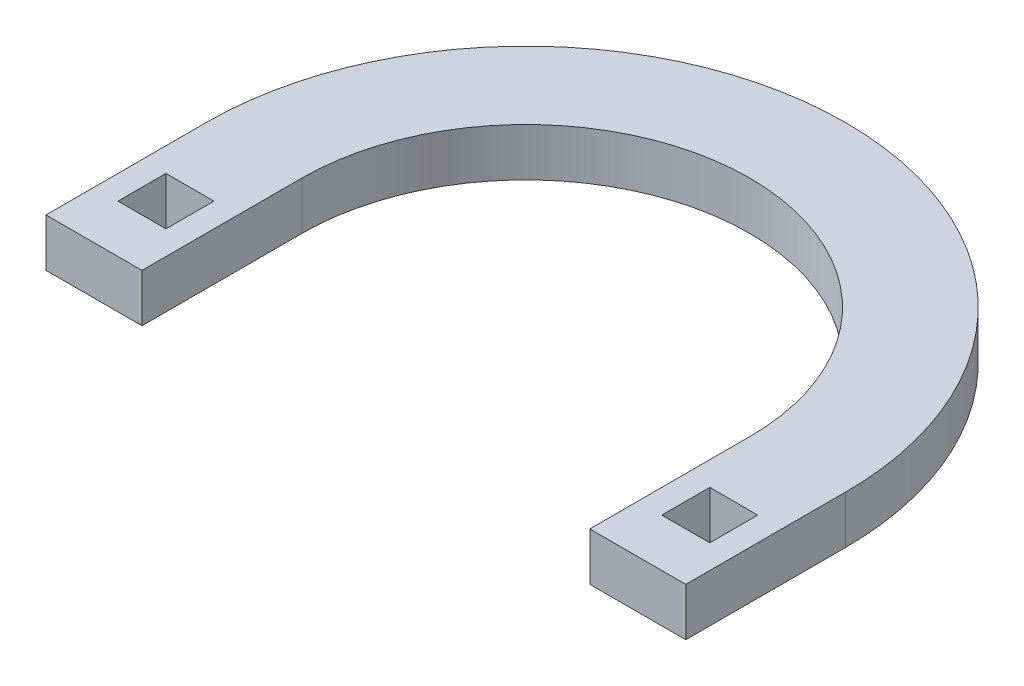
ISO-10303-21;
HEADER;
FILE_DESCRIPTION(('STEP AP214'),'2;1');
FILE_NAME('part.step','',(''),(''),'','','');
FILE_SCHEMA(('AUTOMOTIVE_DESIGN { 1 0 10303 214 1 1 1 1 }'));
ENDSEC;
DATA;
#1=APPLICATION_CONTEXT('core data for automotive mechanical design processes');
#2=APPLICATION_PROTOCOL_DEFINITION('international standard','automotive_design',2000,#1);
#3=PRODUCT_CONTEXT('',#1,'mechanical');
#4=PRODUCT('Part','Part','',(#3));
#5=PRODUCT_RELATED_PRODUCT_CATEGORY('part','',(#4));
#6=PRODUCT_DEFINITION_FORMATION('','',#4);
#7=PRODUCT_DEFINITION_CONTEXT('part definition',#1,'design');
#8=PRODUCT_DEFINITION('design','',#6,#7);
#9=PRODUCT_DEFINITION_SHAPE('','',#8);
#10=(LENGTH_UNIT() NAMED_UNIT(*) SI_UNIT(.MILLI.,.METRE.));
#11=(NAMED_UNIT(*) PLANE_ANGLE_UNIT() SI_UNIT($,.RADIAN.));
#12=(NAMED_UNIT(*) SI_UNIT($,.STERADIAN.) SOLID_ANGLE_UNIT());
#13=UNCERTAINTY_MEASURE_WITH_UNIT(LENGTH_MEASURE(1.E-05),#10,'distance_accuracy_value','');
#14=(GEOMETRIC_REPRESENTATION_CONTEXT(3) GLOBAL_UNCERTAINTY_ASSIGNED_CONTEXT((#13)) GLOBAL_UNIT_ASSIGNED_CONTEXT((#10,
#11,#12)) REPRESENTATION_CONTEXT('',''));
#15=CARTESIAN_POINT('',(0.,0.,0.));
#16=DIRECTION('',(0.,0.,1.));
#17=DIRECTION('',(1.,0.,0.));
#18=AXIS2_PLACEMENT_3D('',#15,#16,#17);
#19=CARTESIAN_POINT('',(0.,3.,0.));
#20=DIRECTION('',(0.,-1.,0.));
#21=DIRECTION('',(0.,0.,-1.));
#22=AXIS2_PLACEMENT_3D('',#19,#20,#21);
#23=CYLINDRICAL_SURFACE('',#22,20.);
#24=CARTESIAN_POINT('',(0.,0.,0.));
#25=DIRECTION('',(0.,1.,0.));
#26=DIRECTION('',(0.,0.,-1.));
#27=AXIS2_PLACEMENT_3D('',#24,#25,#26);
#28=CIRCLE('',#27,20.);
#29=CARTESIAN_POINT('',(20.,0.,0.));
#30=VERTEX_POINT('',#29);
#31=CARTESIAN_POINT('',(-20.,0.,0.));
#32=VERTEX_POINT('',#31);
#33=EDGE_CURVE('E219',#30,#32,#28,.T.);
#34=ORIENTED_EDGE('',*,*,#33,.T.);
#35=DIRECTION('',(0.,-1.,0.));
#36=VECTOR('',#35,1.);
#37=CARTESIAN_POINT('',(-20.,3.,0.));
#38=LINE('',#37,#36);
#39=CARTESIAN_POINT('',(-20.,3.,0.));
#40=VERTEX_POINT('',#39);
#41=EDGE_CURVE('E11',#40,#32,#38,.T.);
#42=ORIENTED_EDGE('',*,*,#41,.F.);
#43=CARTESIAN_POINT('',(0.,3.,0.));
#44=DIRECTION('',(0.,1.,0.));
#45=DIRECTION('',(0.,0.,-1.));
#46=AXIS2_PLACEMENT_3D('',#43,#44,#45);
#47=CIRCLE('',#46,20.);
#48=CARTESIAN_POINT('',(20.,3.,0.));
#49=VERTEX_POINT('',#48);
#50=EDGE_CURVE('E220',#49,#40,#47,.T.);
#51=ORIENTED_EDGE('',*,*,#50,.F.);
#52=DIRECTION('',(0.,-1.,0.));
#53=VECTOR('',#52,1.);
#54=CARTESIAN_POINT('',(20.,3.,0.));
#55=LINE('',#54,#53);
#56=EDGE_CURVE('E238',#49,#30,#55,.T.);
#57=ORIENTED_EDGE('',*,*,#56,.T.);
#58=EDGE_LOOP('',(#34,#42,#51,#57));
#59=FACE_BOUND('',#58,.T.);
#60=ADVANCED_FACE('F32',(#59),#23,.T.);
#61=CARTESIAN_POINT('',(-20.,3.,0.));
#62=DIRECTION('',(1.,0.,0.));
#63=DIRECTION('',(0.,0.,-1.));
#64=AXIS2_PLACEMENT_3D('',#61,#62,#63);
#65=PLANE('',#64);
#66=DIRECTION('',(0.,0.,1.));
#67=VECTOR('',#66,1.);
#68=CARTESIAN_POINT('',(-20.,0.,0.));
#69=LINE('',#68,#67);
#70=CARTESIAN_POINT('',(-20.,0.,10.));
#71=VERTEX_POINT('',#70);
#72=EDGE_CURVE('E241',#32,#71,#69,.T.);
#73=ORIENTED_EDGE('',*,*,#72,.T.);
#74=DIRECTION('',(0.,-1.,0.));
#75=VECTOR('',#74,1.);
#76=CARTESIAN_POINT('',(-20.,3.,10.));
#77=LINE('',#76,#75);
#78=CARTESIAN_POINT('',(-20.,3.,10.));
#79=VERTEX_POINT('',#78);
#80=EDGE_CURVE('E39',#79,#71,#77,.T.);
#81=ORIENTED_EDGE('',*,*,#80,.F.);
#82=DIRECTION('',(0.,0.,1.));
#83=VECTOR('',#82,1.);
#84=CARTESIAN_POINT('',(-20.,3.,0.));
#85=LINE('',#84,#83);
#86=EDGE_CURVE('E223',#40,#79,#85,.T.);
#87=ORIENTED_EDGE('',*,*,#86,.F.);
#88=ORIENTED_EDGE('',*,*,#41,.T.);
#89=EDGE_LOOP('',(#73,#81,#87,#88));
#90=FACE_BOUND('',#89,.T.);
#91=ADVANCED_FACE('F297',(#90),#65,.F.);
#92=CARTESIAN_POINT('',(-20.,3.,10.));
#93=DIRECTION('',(0.,0.,-1.));
#94=DIRECTION('',(-1.,0.,0.));
#95=AXIS2_PLACEMENT_3D('',#92,#93,#94);
#96=PLANE('',#95);
#97=DIRECTION('',(1.,0.,0.));
#98=VECTOR('',#97,1.);
#99=CARTESIAN_POINT('',(-20.,0.,10.));
#100=LINE('',#99,#98);
#101=CARTESIAN_POINT('',(-14.,0.,10.));
#102=VERTEX_POINT('',#101);
#103=EDGE_CURVE('E243',#71,#102,#100,.T.);
#104=ORIENTED_EDGE('',*,*,#103,.T.);
#105=DIRECTION('',(0.,-1.,0.));
#106=VECTOR('',#105,1.);
#107=CARTESIAN_POINT('',(-14.,3.,10.));
#108=LINE('',#107,#106);
#109=CARTESIAN_POINT('',(-14.,3.,10.));
#110=VERTEX_POINT('',#109);
#111=EDGE_CURVE('E268',#110,#102,#108,.T.);
#112=ORIENTED_EDGE('',*,*,#111,.F.);
#113=DIRECTION('',(1.,0.,0.));
#114=VECTOR('',#113,1.);
#115=CARTESIAN_POINT('',(-20.,3.,10.));
#116=LINE('',#115,#114);
#117=EDGE_CURVE('E226',#79,#110,#116,.T.);
#118=ORIENTED_EDGE('',*,*,#117,.F.);
#119=ORIENTED_EDGE('',*,*,#80,.T.);
#120=EDGE_LOOP('',(#104,#112,#118,#119));
#121=FACE_BOUND('',#120,.T.);
#122=ADVANCED_FACE('F275',(#121),#96,.F.);
#123=CARTESIAN_POINT('',(-14.,3.,0.));
#124=DIRECTION('',(-1.,0.,0.));
#125=DIRECTION('',(0.,0.,1.));
#126=AXIS2_PLACEMENT_3D('',#123,#124,#125);
#127=PLANE('',#126);
#128=DIRECTION('',(0.,0.,-1.));
#129=VECTOR('',#128,1.);
#130=CARTESIAN_POINT('',(-14.,0.,0.));
#131=LINE('',#130,#129);
#132=CARTESIAN_POINT('',(-14.,0.,0.));
#133=VERTEX_POINT('',#132);
#134=EDGE_CURVE('E245',#102,#133,#131,.T.);
#135=ORIENTED_EDGE('',*,*,#134,.T.);
#136=DIRECTION('',(0.,-1.,0.));
#137=VECTOR('',#136,1.);
#138=CARTESIAN_POINT('',(-14.,3.,0.));
#139=LINE('',#138,#137);
#140=CARTESIAN_POINT('',(-14.,3.,0.));
#141=VERTEX_POINT('',#140);
#142=EDGE_CURVE('E265',#141,#133,#139,.T.);
#143=ORIENTED_EDGE('',*,*,#142,.F.);
#144=DIRECTION('',(0.,0.,-1.));
#145=VECTOR('',#144,1.);
#146=CARTESIAN_POINT('',(-14.,3.,0.));
#147=LINE('',#146,#145);
#148=EDGE_CURVE('E228',#110,#141,#147,.T.);
#149=ORIENTED_EDGE('',*,*,#148,.F.);
#150=ORIENTED_EDGE('',*,*,#111,.T.);
#151=EDGE_LOOP('',(#135,#143,#149,#150));
#152=FACE_BOUND('',#151,.T.);
#153=ADVANCED_FACE('F285',(#152),#127,.F.);
#154=CARTESIAN_POINT('',(0.,3.,0.));
#155=DIRECTION('',(0.,-1.,0.));
#156=DIRECTION('',(0.,0.,-1.));
#157=AXIS2_PLACEMENT_3D('',#154,#155,#156);
#158=CYLINDRICAL_SURFACE('',#157,14.);
#159=CARTESIAN_POINT('',(0.,0.,0.));
#160=DIRECTION('',(0.,-1.,0.));
#161=DIRECTION('',(0.,0.,-1.));
#162=AXIS2_PLACEMENT_3D('',#159,#160,#161);
#163=CIRCLE('',#162,14.);
#164=CARTESIAN_POINT('',(14.,0.,0.));
#165=VERTEX_POINT('',#164);
#166=EDGE_CURVE('E247',#133,#165,#163,.T.);
#167=ORIENTED_EDGE('',*,*,#166,.T.);
#168=DIRECTION('',(0.,-1.,0.));
#169=VECTOR('',#168,1.);
#170=CARTESIAN_POINT('',(14.,3.,0.));
#171=LINE('',#170,#169);
#172=CARTESIAN_POINT('',(14.,3.,0.));
#173=VERTEX_POINT('',#172);
#174=EDGE_CURVE('E262',#173,#165,#171,.T.);
#175=ORIENTED_EDGE('',*,*,#174,.F.);
#176=CARTESIAN_POINT('',(0.,3.,0.));
#177=DIRECTION('',(0.,-1.,0.));
#178=DIRECTION('',(0.,0.,-1.));
#179=AXIS2_PLACEMENT_3D('',#176,#177,#178);
#180=CIRCLE('',#179,14.);
#181=EDGE_CURVE('E230',#141,#173,#180,.T.);
#182=ORIENTED_EDGE('',*,*,#181,.F.);
#183=ORIENTED_EDGE('',*,*,#142,.T.);
#184=EDGE_LOOP('',(#167,#175,#182,#183));
#185=FACE_BOUND('',#184,.T.);
#186=ADVANCED_FACE('F289',(#185),#158,.F.);
#187=CARTESIAN_POINT('',(14.0000000000001,3.,0.));
#188=DIRECTION('',(1.,0.,0.));
#189=DIRECTION('',(0.,0.,-1.));
#190=AXIS2_PLACEMENT_3D('',#187,#188,#189);
#191=PLANE('',#190);
#192=DIRECTION('',(0.,0.,1.));
#193=VECTOR('',#192,1.);
#194=CARTESIAN_POINT('',(14.0000000000001,0.,0.));
#195=LINE('',#194,#193);
#196=CARTESIAN_POINT('',(14.0000000000001,0.,10.));
#197=VERTEX_POINT('',#196);
#198=EDGE_CURVE('E249',#165,#197,#195,.T.);
#199=ORIENTED_EDGE('',*,*,#198,.T.);
#200=DIRECTION('',(0.,-1.,0.));
#201=VECTOR('',#200,1.);
#202=CARTESIAN_POINT('',(14.0000000000001,3.,10.));
#203=LINE('',#202,#201);
#204=CARTESIAN_POINT('',(14.0000000000001,3.,10.));
#205=VERTEX_POINT('',#204);
#206=EDGE_CURVE('E259',#205,#197,#203,.T.);
#207=ORIENTED_EDGE('',*,*,#206,.F.);
#208=DIRECTION('',(0.,0.,1.));
#209=VECTOR('',#208,1.);
#210=CARTESIAN_POINT('',(14.0000000000001,3.,0.));
#211=LINE('',#210,#209);
#212=EDGE_CURVE('E232',#173,#205,#211,.T.);
#213=ORIENTED_EDGE('',*,*,#212,.F.);
#214=ORIENTED_EDGE('',*,*,#174,.T.);
#215=EDGE_LOOP('',(#199,#207,#213,#214));
#216=FACE_BOUND('',#215,.T.);
#217=ADVANCED_FACE('F310',(#216),#191,.F.);
#218=CARTESIAN_POINT('',(14.0000000000001,3.,10.));
#219=DIRECTION('',(0.,0.,-1.));
#220=DIRECTION('',(-1.,0.,0.));
#221=AXIS2_PLACEMENT_3D('',#218,#219,#220);
#222=PLANE('',#221);
#223=DIRECTION('',(1.,0.,0.));
#224=VECTOR('',#223,1.);
#225=CARTESIAN_POINT('',(14.0000000000001,0.,10.));
#226=LINE('',#225,#224);
#227=CARTESIAN_POINT('',(20.,0.,10.));
#228=VERTEX_POINT('',#227);
#229=EDGE_CURVE('E251',#197,#228,#226,.T.);
#230=ORIENTED_EDGE('',*,*,#229,.T.);
#231=DIRECTION('',(0.,-1.,0.));
#232=VECTOR('',#231,1.);
#233=CARTESIAN_POINT('',(20.,3.,10.));
#234=LINE('',#233,#232);
#235=CARTESIAN_POINT('',(20.,3.,10.));
#236=VERTEX_POINT('',#235);
#237=EDGE_CURVE('E256',#236,#228,#234,.T.);
#238=ORIENTED_EDGE('',*,*,#237,.F.);
#239=DIRECTION('',(1.,0.,0.));
#240=VECTOR('',#239,1.);
#241=CARTESIAN_POINT('',(14.0000000000001,3.,10.));
#242=LINE('',#241,#240);
#243=EDGE_CURVE('E234',#205,#236,#242,.T.);
#244=ORIENTED_EDGE('',*,*,#243,.F.);
#245=ORIENTED_EDGE('',*,*,#206,.T.);
#246=EDGE_LOOP('',(#230,#238,#244,#245));
#247=FACE_BOUND('',#246,.T.);
#248=ADVANCED_FACE('F308',(#247),#222,.F.);
#249=CARTESIAN_POINT('',(20.,3.,0.));
#250=DIRECTION('',(-1.,0.,0.));
#251=DIRECTION('',(0.,0.,1.));
#252=AXIS2_PLACEMENT_3D('',#249,#250,#251);
#253=PLANE('',#252);
#254=DIRECTION('',(0.,0.,-1.));
#255=VECTOR('',#254,1.);
#256=CARTESIAN_POINT('',(20.,0.,0.));
#257=LINE('',#256,#255);
#258=EDGE_CURVE('E224',#228,#30,#257,.T.);
#259=ORIENTED_EDGE('',*,*,#258,.T.);
#260=ORIENTED_EDGE('',*,*,#56,.F.);
#261=DIRECTION('',(0.,0.,-1.));
#262=VECTOR('',#261,1.);
#263=CARTESIAN_POINT('',(20.,3.,0.));
#264=LINE('',#263,#262);
#265=EDGE_CURVE('E236',#236,#49,#264,.T.);
#266=ORIENTED_EDGE('',*,*,#265,.F.);
#267=ORIENTED_EDGE('',*,*,#237,.T.);
#268=EDGE_LOOP('',(#259,#260,#266,#267));
#269=FACE_BOUND('',#268,.T.);
#270=ADVANCED_FACE('F303',(#269),#253,.F.);
#271=CARTESIAN_POINT('',(0.,3.,0.));
#272=DIRECTION('',(0.,-1.,0.));
#273=DIRECTION('',(0.,0.,-1.));
#274=AXIS2_PLACEMENT_3D('',#271,#272,#273);
#275=PLANE('',#274);
#276=DIRECTION('',(-1.,0.,0.));
#277=VECTOR('',#276,1.);
#278=CARTESIAN_POINT('',(0.,3.,7.));
#279=LINE('',#278,#277);
#280=CARTESIAN_POINT('',(-15.5,3.,7.));
#281=VERTEX_POINT('',#280);
#282=CARTESIAN_POINT('',(-18.5,3.,7.));
#283=VERTEX_POINT('',#282);
#284=EDGE_CURVE('E210',#281,#283,#279,.T.);
#285=ORIENTED_EDGE('',*,*,#284,.T.);
#286=DIRECTION('',(0.,0.,-1.));
#287=VECTOR('',#286,1.);
#288=CARTESIAN_POINT('',(-18.5,3.,0.));
#289=LINE('',#288,#287);
#290=CARTESIAN_POINT('',(-18.5,3.,4.));
#291=VERTEX_POINT('',#290);
#292=EDGE_CURVE('E149',#283,#291,#289,.T.);
#293=ORIENTED_EDGE('',*,*,#292,.T.);
#294=DIRECTION('',(1.,0.,0.));
#295=VECTOR('',#294,1.);
#296=CARTESIAN_POINT('',(0.,3.,4.));
#297=LINE('',#296,#295);
#298=CARTESIAN_POINT('',(-15.5,3.,4.));
#299=VERTEX_POINT('',#298);
#300=EDGE_CURVE('E215',#291,#299,#297,.T.);
#301=ORIENTED_EDGE('',*,*,#300,.T.);
#302=DIRECTION('',(0.,0.,1.));
#303=VECTOR('',#302,1.);
#304=CARTESIAN_POINT('',(-15.5,3.,0.));
#305=LINE('',#304,#303);
#306=EDGE_CURVE('E212',#299,#281,#305,.T.);
#307=ORIENTED_EDGE('',*,*,#306,.T.);
#308=EDGE_LOOP('',(#285,#293,#301,#307));
#309=FACE_BOUND('',#308,.T.);
#310=DIRECTION('',(-1.,0.,0.));
#311=VECTOR('',#310,1.);
#312=CARTESIAN_POINT('',(0.,3.,7.));
#313=LINE('',#312,#311);
#314=CARTESIAN_POINT('',(18.5,3.,7.));
#315=VERTEX_POINT('',#314);
#316=CARTESIAN_POINT('',(15.5,3.,7.));
#317=VERTEX_POINT('',#316);
#318=EDGE_CURVE('E176',#315,#317,#313,.T.);
#319=ORIENTED_EDGE('',*,*,#318,.T.);
#320=DIRECTION('',(0.,0.,-1.));
#321=VECTOR('',#320,1.);
#322=CARTESIAN_POINT('',(15.5,3.,0.));
#323=LINE('',#322,#321);
#324=CARTESIAN_POINT('',(15.5,3.,4.));
#325=VERTEX_POINT('',#324);
#326=EDGE_CURVE('E207',#317,#325,#323,.T.);
#327=ORIENTED_EDGE('',*,*,#326,.T.);
#328=DIRECTION('',(1.,0.,0.));
#329=VECTOR('',#328,1.);
#330=CARTESIAN_POINT('',(0.,3.,4.));
#331=LINE('',#330,#329);
#332=CARTESIAN_POINT('',(18.5,3.,4.));
#333=VERTEX_POINT('',#332);
#334=EDGE_CURVE('E204',#325,#333,#331,.T.);
#335=ORIENTED_EDGE('',*,*,#334,.T.);
#336=DIRECTION('',(0.,0.,1.));
#337=VECTOR('',#336,1.);
#338=CARTESIAN_POINT('',(18.5,3.,0.));
#339=LINE('',#338,#337);
#340=EDGE_CURVE('E201',#333,#315,#339,.T.);
#341=ORIENTED_EDGE('',*,*,#340,.T.);
#342=EDGE_LOOP('',(#319,#327,#335,#341));
#343=FACE_BOUND('',#342,.T.);
#344=ORIENTED_EDGE('',*,*,#50,.T.);
#345=ORIENTED_EDGE('',*,*,#86,.T.);
#346=ORIENTED_EDGE('',*,*,#117,.T.);
#347=ORIENTED_EDGE('',*,*,#148,.T.);
#348=ORIENTED_EDGE('',*,*,#181,.T.);
#349=ORIENTED_EDGE('',*,*,#212,.T.);
#350=ORIENTED_EDGE('',*,*,#243,.T.);
#351=ORIENTED_EDGE('',*,*,#265,.T.);
#352=EDGE_LOOP('',(#344,#345,#346,#347,#348,#349,#350,#351));
#353=FACE_BOUND('',#352,.T.);
#354=ADVANCED_FACE('F293',(#309,#343,#353),#275,.F.);
#355=CARTESIAN_POINT('',(0.,0.,0.));
#356=DIRECTION('',(0.,-1.,0.));
#357=DIRECTION('',(0.,0.,-1.));
#358=AXIS2_PLACEMENT_3D('',#355,#356,#357);
#359=PLANE('',#358);
#360=DIRECTION('',(0.,0.,1.));
#361=VECTOR('',#360,1.);
#362=CARTESIAN_POINT('',(-18.5,0.,4.));
#363=LINE('',#362,#361);
#364=CARTESIAN_POINT('',(-18.5,0.,4.));
#365=VERTEX_POINT('',#364);
#366=CARTESIAN_POINT('',(-18.5,0.,7.));
#367=VERTEX_POINT('',#366);
#368=EDGE_CURVE('E146',#365,#367,#363,.T.);
#369=ORIENTED_EDGE('',*,*,#368,.T.);
#370=DIRECTION('',(1.,0.,0.));
#371=VECTOR('',#370,1.);
#372=CARTESIAN_POINT('',(-18.5,0.,7.));
#373=LINE('',#372,#371);
#374=CARTESIAN_POINT('',(-15.5,0.,7.));
#375=VERTEX_POINT('',#374);
#376=EDGE_CURVE('E156',#367,#375,#373,.T.);
#377=ORIENTED_EDGE('',*,*,#376,.T.);
#378=DIRECTION('',(0.,0.,-1.));
#379=VECTOR('',#378,1.);
#380=CARTESIAN_POINT('',(-15.5,0.,4.));
#381=LINE('',#380,#379);
#382=CARTESIAN_POINT('',(-15.5,0.,4.));
#383=VERTEX_POINT('',#382);
#384=EDGE_CURVE('E161',#375,#383,#381,.T.);
#385=ORIENTED_EDGE('',*,*,#384,.T.);
#386=DIRECTION('',(-1.,0.,0.));
#387=VECTOR('',#386,1.);
#388=CARTESIAN_POINT('',(-18.5,0.,4.));
#389=LINE('',#388,#387);
#390=EDGE_CURVE('E152',#383,#365,#389,.T.);
#391=ORIENTED_EDGE('',*,*,#390,.T.);
#392=EDGE_LOOP('',(#369,#377,#385,#391));
#393=FACE_BOUND('',#392,.T.);
#394=DIRECTION('',(0.,0.,1.));
#395=VECTOR('',#394,1.);
#396=CARTESIAN_POINT('',(15.5,0.,7.));
#397=LINE('',#396,#395);
#398=CARTESIAN_POINT('',(15.5,0.,4.));
#399=VERTEX_POINT('',#398);
#400=CARTESIAN_POINT('',(15.5,0.,7.));
#401=VERTEX_POINT('',#400);
#402=EDGE_CURVE('E181',#399,#401,#397,.T.);
#403=ORIENTED_EDGE('',*,*,#402,.T.);
#404=DIRECTION('',(1.,0.,0.));
#405=VECTOR('',#404,1.);
#406=CARTESIAN_POINT('',(15.5,0.,7.));
#407=LINE('',#406,#405);
#408=CARTESIAN_POINT('',(18.5,0.,7.));
#409=VERTEX_POINT('',#408);
#410=EDGE_CURVE('E184',#401,#409,#407,.T.);
#411=ORIENTED_EDGE('',*,*,#410,.T.);
#412=DIRECTION('',(0.,0.,-1.));
#413=VECTOR('',#412,1.);
#414=CARTESIAN_POINT('',(18.5,0.,7.));
#415=LINE('',#414,#413);
#416=CARTESIAN_POINT('',(18.5,0.,4.));
#417=VERTEX_POINT('',#416);
#418=EDGE_CURVE('E187',#409,#417,#415,.T.);
#419=ORIENTED_EDGE('',*,*,#418,.T.);
#420=DIRECTION('',(-1.,0.,0.));
#421=VECTOR('',#420,1.);
#422=CARTESIAN_POINT('',(15.5,0.,4.));
#423=LINE('',#422,#421);
#424=EDGE_CURVE('E190',#417,#399,#423,.T.);
#425=ORIENTED_EDGE('',*,*,#424,.T.);
#426=EDGE_LOOP('',(#403,#411,#419,#425));
#427=FACE_BOUND('',#426,.T.);
#428=ORIENTED_EDGE('',*,*,#33,.F.);
#429=ORIENTED_EDGE('',*,*,#258,.F.);
#430=ORIENTED_EDGE('',*,*,#229,.F.);
#431=ORIENTED_EDGE('',*,*,#198,.F.);
#432=ORIENTED_EDGE('',*,*,#166,.F.);
#433=ORIENTED_EDGE('',*,*,#134,.F.);
#434=ORIENTED_EDGE('',*,*,#103,.F.);
#435=ORIENTED_EDGE('',*,*,#72,.F.);
#436=EDGE_LOOP('',(#428,#429,#430,#431,#432,#433,#434,#435));
#437=FACE_BOUND('',#436,.T.);
#438=ADVANCED_FACE('F163',(#393,#427,#437),#359,.T.);
#439=CARTESIAN_POINT('',(15.5,0.,7.));
#440=DIRECTION('',(-1.,0.,0.));
#441=DIRECTION('',(0.,0.,1.));
#442=AXIS2_PLACEMENT_3D('',#439,#440,#441);
#443=PLANE('',#442);
#444=DIRECTION('',(0.,1.,0.));
#445=VECTOR('',#444,1.);
#446=CARTESIAN_POINT('',(15.5,0.,7.));
#447=LINE('',#446,#445);
#448=EDGE_CURVE('E54',#401,#317,#447,.T.);
#449=ORIENTED_EDGE('',*,*,#448,.F.);
#450=ORIENTED_EDGE('',*,*,#402,.F.);
#451=DIRECTION('',(0.,1.,0.));
#452=VECTOR('',#451,1.);
#453=CARTESIAN_POINT('',(15.5,0.,4.));
#454=LINE('',#453,#452);
#455=EDGE_CURVE('E166',#399,#325,#454,.T.);
#456=ORIENTED_EDGE('',*,*,#455,.T.);
#457=ORIENTED_EDGE('',*,*,#326,.F.);
#458=EDGE_LOOP('',(#449,#450,#456,#457));
#459=FACE_BOUND('',#458,.T.);
#460=ADVANCED_FACE('F370',(#459),#443,.F.);
#461=CARTESIAN_POINT('',(15.5,0.,4.));
#462=DIRECTION('',(0.,0.,-1.));
#463=DIRECTION('',(-1.,0.,0.));
#464=AXIS2_PLACEMENT_3D('',#461,#462,#463);
#465=PLANE('',#464);
#466=ORIENTED_EDGE('',*,*,#455,.F.);
#467=ORIENTED_EDGE('',*,*,#424,.F.);
#468=DIRECTION('',(0.,1.,0.));
#469=VECTOR('',#468,1.);
#470=CARTESIAN_POINT('',(18.5,0.,4.));
#471=LINE('',#470,#469);
#472=EDGE_CURVE('E169',#417,#333,#471,.T.);
#473=ORIENTED_EDGE('',*,*,#472,.T.);
#474=ORIENTED_EDGE('',*,*,#334,.F.);
#475=EDGE_LOOP('',(#466,#467,#473,#474));
#476=FACE_BOUND('',#475,.T.);
#477=ADVANCED_FACE('F378',(#476),#465,.F.);
#478=CARTESIAN_POINT('',(18.5,0.,7.));
#479=DIRECTION('',(1.,0.,0.));
#480=DIRECTION('',(0.,0.,-1.));
#481=AXIS2_PLACEMENT_3D('',#478,#479,#480);
#482=PLANE('',#481);
#483=ORIENTED_EDGE('',*,*,#472,.F.);
#484=ORIENTED_EDGE('',*,*,#418,.F.);
#485=DIRECTION('',(0.,1.,0.));
#486=VECTOR('',#485,1.);
#487=CARTESIAN_POINT('',(18.5,0.,7.));
#488=LINE('',#487,#486);
#489=EDGE_CURVE('E195',#409,#315,#488,.T.);
#490=ORIENTED_EDGE('',*,*,#489,.T.);
#491=ORIENTED_EDGE('',*,*,#340,.F.);
#492=EDGE_LOOP('',(#483,#484,#490,#491));
#493=FACE_BOUND('',#492,.T.);
#494=ADVANCED_FACE('F388',(#493),#482,.F.);
#495=CARTESIAN_POINT('',(15.5,0.,7.));
#496=DIRECTION('',(0.,0.,1.));
#497=DIRECTION('',(1.,0.,0.));
#498=AXIS2_PLACEMENT_3D('',#495,#496,#497);
#499=PLANE('',#498);
#500=ORIENTED_EDGE('',*,*,#489,.F.);
#501=ORIENTED_EDGE('',*,*,#410,.F.);
#502=ORIENTED_EDGE('',*,*,#448,.T.);
#503=ORIENTED_EDGE('',*,*,#318,.F.);
#504=EDGE_LOOP('',(#500,#501,#502,#503));
#505=FACE_BOUND('',#504,.T.);
#506=ADVANCED_FACE('F398',(#505),#499,.F.);
#507=CARTESIAN_POINT('',(-18.5,0.,4.));
#508=DIRECTION('',(-1.,0.,0.));
#509=DIRECTION('',(0.,0.,1.));
#510=AXIS2_PLACEMENT_3D('',#507,#508,#509);
#511=PLANE('',#510);
#512=DIRECTION('',(0.,1.,0.));
#513=VECTOR('',#512,1.);
#514=CARTESIAN_POINT('',(-18.5,0.,7.));
#515=LINE('',#514,#513);
#516=EDGE_CURVE('E46',#367,#283,#515,.T.);
#517=ORIENTED_EDGE('',*,*,#516,.F.);
#518=ORIENTED_EDGE('',*,*,#368,.F.);
#519=DIRECTION('',(0.,1.,0.));
#520=VECTOR('',#519,1.);
#521=CARTESIAN_POINT('',(-18.5,0.,4.));
#522=LINE('',#521,#520);
#523=EDGE_CURVE('E174',#365,#291,#522,.T.);
#524=ORIENTED_EDGE('',*,*,#523,.T.);
#525=ORIENTED_EDGE('',*,*,#292,.F.);
#526=EDGE_LOOP('',(#517,#518,#524,#525));
#527=FACE_BOUND('',#526,.T.);
#528=ADVANCED_FACE('F143',(#527),#511,.F.);
#529=CARTESIAN_POINT('',(-18.5,0.,4.));
#530=DIRECTION('',(0.,0.,-1.));
#531=DIRECTION('',(-1.,0.,0.));
#532=AXIS2_PLACEMENT_3D('',#529,#530,#531);
#533=PLANE('',#532);
#534=ORIENTED_EDGE('',*,*,#523,.F.);
#535=ORIENTED_EDGE('',*,*,#390,.F.);
#536=DIRECTION('',(0.,1.,0.));
#537=VECTOR('',#536,1.);
#538=CARTESIAN_POINT('',(-15.5,0.,4.));
#539=LINE('',#538,#537);
#540=EDGE_CURVE('E177',#383,#299,#539,.T.);
#541=ORIENTED_EDGE('',*,*,#540,.T.);
#542=ORIENTED_EDGE('',*,*,#300,.F.);
#543=EDGE_LOOP('',(#534,#535,#541,#542));
#544=FACE_BOUND('',#543,.T.);
#545=ADVANCED_FACE('F416',(#544),#533,.F.);
#546=CARTESIAN_POINT('',(-15.5,0.,4.));
#547=DIRECTION('',(1.,0.,0.));
#548=DIRECTION('',(0.,0.,-1.));
#549=AXIS2_PLACEMENT_3D('',#546,#547,#548);
#550=PLANE('',#549);
#551=ORIENTED_EDGE('',*,*,#540,.F.);
#552=ORIENTED_EDGE('',*,*,#384,.F.);
#553=DIRECTION('',(0.,1.,0.));
#554=VECTOR('',#553,1.);
#555=CARTESIAN_POINT('',(-15.5,0.,7.));
#556=LINE('',#555,#554);
#557=EDGE_CURVE('E151',#375,#281,#556,.T.);
#558=ORIENTED_EDGE('',*,*,#557,.T.);
#559=ORIENTED_EDGE('',*,*,#306,.F.);
#560=EDGE_LOOP('',(#551,#552,#558,#559));
#561=FACE_BOUND('',#560,.T.);
#562=ADVANCED_FACE('F425',(#561),#550,.F.);
#563=CARTESIAN_POINT('',(-18.5,0.,7.));
#564=DIRECTION('',(0.,0.,1.));
#565=DIRECTION('',(1.,0.,0.));
#566=AXIS2_PLACEMENT_3D('',#563,#564,#565);
#567=PLANE('',#566);
#568=ORIENTED_EDGE('',*,*,#557,.F.);
#569=ORIENTED_EDGE('',*,*,#376,.F.);
#570=ORIENTED_EDGE('',*,*,#516,.T.);
#571=ORIENTED_EDGE('',*,*,#284,.F.);
#572=EDGE_LOOP('',(#568,#569,#570,#571));
#573=FACE_BOUND('',#572,.T.);
#574=ADVANCED_FACE('F157',(#573),#567,.F.);
#575=CLOSED_SHELL('',(#60,#91,#122,#153,#186,#217,#248,#270,#354,#438,#460,#477,#494,#506,#528,
#545,#562,#574));
#576=MANIFOLD_SOLID_BREP('B2',#575);
#577=ADVANCED_BREP_SHAPE_REPRESENTATION('',(#18,#576),#14);
#578=SHAPE_DEFINITION_REPRESENTATION(#9,#577);
ENDSEC;
END-ISO-10303-21;
